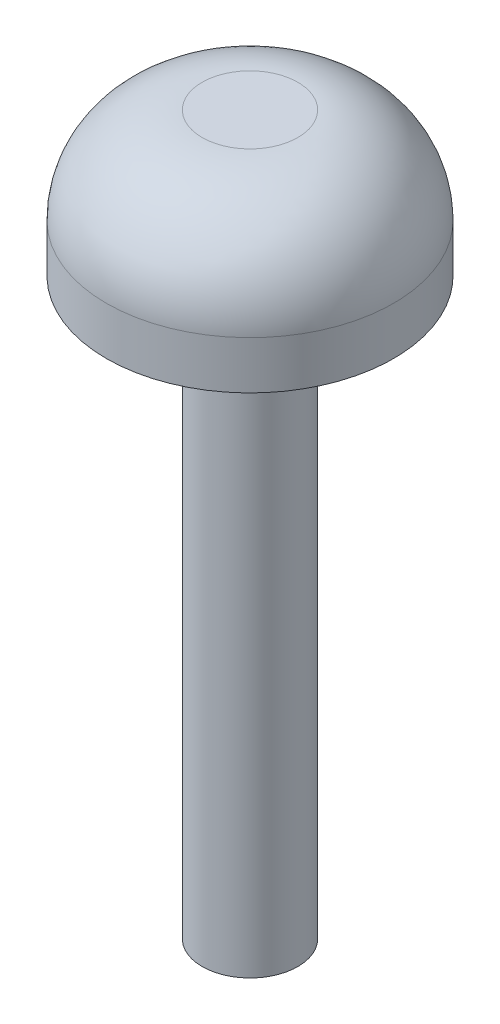
ISO-10303-21;
HEADER;
FILE_DESCRIPTION(('STEP AP214'),'2;1');
FILE_NAME('part.step','',(''),(''),'','','');
FILE_SCHEMA(('AUTOMOTIVE_DESIGN { 1 0 10303 214 1 1 1 1 }'));
ENDSEC;
DATA;
#1=APPLICATION_CONTEXT('core data for automotive mechanical design processes');
#2=APPLICATION_PROTOCOL_DEFINITION('international standard','automotive_design',2000,#1);
#3=PRODUCT_CONTEXT('',#1,'mechanical');
#4=PRODUCT('Part','Part','',(#3));
#5=PRODUCT_RELATED_PRODUCT_CATEGORY('part','',(#4));
#6=PRODUCT_DEFINITION_FORMATION('','',#4);
#7=PRODUCT_DEFINITION_CONTEXT('part definition',#1,'design');
#8=PRODUCT_DEFINITION('design','',#6,#7);
#9=PRODUCT_DEFINITION_SHAPE('','',#8);
#10=(LENGTH_UNIT() NAMED_UNIT(*) SI_UNIT(.MILLI.,.METRE.));
#11=(NAMED_UNIT(*) PLANE_ANGLE_UNIT() SI_UNIT($,.RADIAN.));
#12=(NAMED_UNIT(*) SI_UNIT($,.STERADIAN.) SOLID_ANGLE_UNIT());
#13=UNCERTAINTY_MEASURE_WITH_UNIT(LENGTH_MEASURE(1.E-05),#10,'distance_accuracy_value','');
#14=(GEOMETRIC_REPRESENTATION_CONTEXT(3) GLOBAL_UNCERTAINTY_ASSIGNED_CONTEXT((#13)) GLOBAL_UNIT_ASSIGNED_CONTEXT((#10,
#11,#12)) REPRESENTATION_CONTEXT('',''));
#15=CARTESIAN_POINT('',(0.,0.,0.));
#16=DIRECTION('',(0.,0.,1.));
#17=DIRECTION('',(1.,0.,0.));
#18=AXIS2_PLACEMENT_3D('',#15,#16,#17);
#19=CARTESIAN_POINT('',(0.,6.,0.));
#20=DIRECTION('',(0.,-1.,0.));
#21=DIRECTION('',(0.,0.,-1.));
#22=AXIS2_PLACEMENT_3D('',#19,#20,#21);
#23=CYLINDRICAL_SURFACE('',#22,0.5);
#24=CARTESIAN_POINT('',(0.,6.,0.));
#25=DIRECTION('',(0.,1.,0.));
#26=DIRECTION('',(0.,0.,1.));
#27=AXIS2_PLACEMENT_3D('',#24,#25,#26);
#28=CIRCLE('',#27,0.5);
#29=CARTESIAN_POINT('',(0.,6.,0.5));
#30=VERTEX_POINT('',#29);
#31=EDGE_CURVE('E49',#30,#30,#28,.T.);
#32=ORIENTED_EDGE('',*,*,#31,.F.);
#33=EDGE_LOOP('',(#32));
#34=FACE_BOUND('',#33,.T.);
#35=CARTESIAN_POINT('',(0.,0.,0.));
#36=DIRECTION('',(0.,1.,0.));
#37=DIRECTION('',(0.,0.,1.));
#38=AXIS2_PLACEMENT_3D('',#35,#36,#37);
#39=CIRCLE('',#38,0.5);
#40=CARTESIAN_POINT('',(0.,0.,0.5));
#41=VERTEX_POINT('',#40);
#42=EDGE_CURVE('E53',#41,#41,#39,.T.);
#43=ORIENTED_EDGE('',*,*,#42,.T.);
#44=EDGE_LOOP('',(#43));
#45=FACE_BOUND('',#44,.T.);
#46=ADVANCED_FACE('F39',(#34,#45),#23,.T.);
#47=CARTESIAN_POINT('',(0.,0.,0.));
#48=DIRECTION('',(0.,1.,0.));
#49=DIRECTION('',(0.,0.,1.));
#50=AXIS2_PLACEMENT_3D('',#47,#48,#49);
#51=PLANE('',#50);
#52=ORIENTED_EDGE('',*,*,#42,.F.);
#53=EDGE_LOOP('',(#52));
#54=FACE_BOUND('',#53,.T.);
#55=ADVANCED_FACE('F77',(#54),#51,.F.);
#56=CARTESIAN_POINT('',(0.,7.5,0.));
#57=DIRECTION('',(0.,-1.,0.));
#58=DIRECTION('',(0.,0.,-1.));
#59=AXIS2_PLACEMENT_3D('',#56,#57,#58);
#60=CYLINDRICAL_SURFACE('',#59,1.5);
#61=CARTESIAN_POINT('',(0.,6.5,0.));
#62=DIRECTION('',(0.,1.,0.));
#63=DIRECTION('',(0.,0.,1.));
#64=AXIS2_PLACEMENT_3D('',#61,#62,#63);
#65=CIRCLE('',#64,1.5);
#66=CARTESIAN_POINT('',(0.,6.5,1.5));
#67=VERTEX_POINT('',#66);
#68=EDGE_CURVE('E10',#67,#67,#65,.F.);
#69=ORIENTED_EDGE('',*,*,#68,.T.);
#70=EDGE_LOOP('',(#69));
#71=FACE_BOUND('',#70,.T.);
#72=CARTESIAN_POINT('',(0.,6.,0.));
#73=DIRECTION('',(0.,1.,0.));
#74=DIRECTION('',(0.,0.,1.));
#75=AXIS2_PLACEMENT_3D('',#72,#73,#74);
#76=CIRCLE('',#75,1.5);
#77=CARTESIAN_POINT('',(0.,6.,1.5));
#78=VERTEX_POINT('',#77);
#79=EDGE_CURVE('E59',#78,#78,#76,.T.);
#80=ORIENTED_EDGE('',*,*,#79,.T.);
#81=EDGE_LOOP('',(#80));
#82=FACE_BOUND('',#81,.T.);
#83=ADVANCED_FACE('F65',(#71,#82),#60,.T.);
#84=CARTESIAN_POINT('',(0.,7.5,0.));
#85=DIRECTION('',(0.,1.,0.));
#86=DIRECTION('',(0.,0.,1.));
#87=AXIS2_PLACEMENT_3D('',#84,#85,#86);
#88=PLANE('',#87);
#89=CARTESIAN_POINT('',(0.,7.5,0.));
#90=DIRECTION('',(0.,1.,0.));
#91=DIRECTION('',(0.,0.,1.));
#92=AXIS2_PLACEMENT_3D('',#89,#90,#91);
#93=CIRCLE('',#92,0.5);
#94=CARTESIAN_POINT('',(0.,7.5,0.5));
#95=VERTEX_POINT('',#94);
#96=EDGE_CURVE('E46',#95,#95,#93,.T.);
#97=ORIENTED_EDGE('',*,*,#96,.T.);
#98=EDGE_LOOP('',(#97));
#99=FACE_BOUND('',#98,.T.);
#100=ADVANCED_FACE('F69',(#99),#88,.T.);
#101=CARTESIAN_POINT('',(0.,6.,0.));
#102=DIRECTION('',(0.,1.,0.));
#103=DIRECTION('',(0.,0.,1.));
#104=AXIS2_PLACEMENT_3D('',#101,#102,#103);
#105=PLANE('',#104);
#106=ORIENTED_EDGE('',*,*,#31,.T.);
#107=EDGE_LOOP('',(#106));
#108=FACE_BOUND('',#107,.T.);
#109=ORIENTED_EDGE('',*,*,#79,.F.);
#110=EDGE_LOOP('',(#109));
#111=FACE_BOUND('',#110,.T.);
#112=ADVANCED_FACE('F62',(#108,#111),#105,.F.);
#113=CARTESIAN_POINT('',(0.,6.5,0.));
#114=DIRECTION('',(0.,1.,0.));
#115=DIRECTION('',(0.,0.,1.));
#116=AXIS2_PLACEMENT_3D('',#113,#114,#115);
#117=DEGENERATE_TOROIDAL_SURFACE('',#116,0.5,1.,.T.);
#118=ORIENTED_EDGE('',*,*,#68,.F.);
#119=EDGE_LOOP('',(#118));
#120=FACE_BOUND('',#119,.T.);
#121=ORIENTED_EDGE('',*,*,#96,.F.);
#122=EDGE_LOOP('',(#121));
#123=FACE_BOUND('',#122,.T.);
#124=ADVANCED_FACE('F41',(#120,#123),#117,.T.);
#125=CLOSED_SHELL('',(#46,#55,#83,#100,#112,#124));
#126=MANIFOLD_SOLID_BREP('B2',#125);
#127=ADVANCED_BREP_SHAPE_REPRESENTATION('',(#18,#126),#14);
#128=SHAPE_DEFINITION_REPRESENTATION(#9,#127);
ENDSEC;
END-ISO-10303-21;
